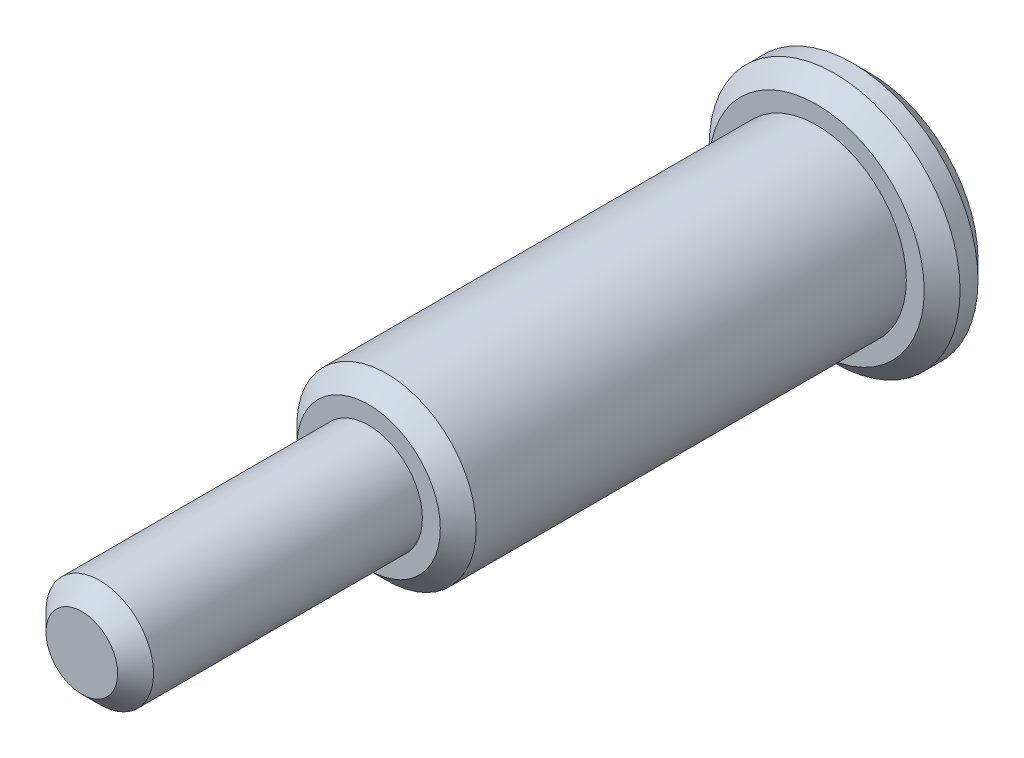
ISO-10303-21;
HEADER;
FILE_DESCRIPTION(('STEP AP214'),'2;1');
FILE_NAME('part.step','',(''),(''),'','','');
FILE_SCHEMA(('AUTOMOTIVE_DESIGN { 1 0 10303 214 1 1 1 1 }'));
ENDSEC;
DATA;
#1=APPLICATION_CONTEXT('core data for automotive mechanical design processes');
#2=APPLICATION_PROTOCOL_DEFINITION('international standard','automotive_design',2000,#1);
#3=PRODUCT_CONTEXT('',#1,'mechanical');
#4=PRODUCT('Part','Part','',(#3));
#5=PRODUCT_RELATED_PRODUCT_CATEGORY('part','',(#4));
#6=PRODUCT_DEFINITION_FORMATION('','',#4);
#7=PRODUCT_DEFINITION_CONTEXT('part definition',#1,'design');
#8=PRODUCT_DEFINITION('design','',#6,#7);
#9=PRODUCT_DEFINITION_SHAPE('','',#8);
#10=(LENGTH_UNIT() NAMED_UNIT(*) SI_UNIT(.MILLI.,.METRE.));
#11=(NAMED_UNIT(*) PLANE_ANGLE_UNIT() SI_UNIT($,.RADIAN.));
#12=(NAMED_UNIT(*) SI_UNIT($,.STERADIAN.) SOLID_ANGLE_UNIT());
#13=UNCERTAINTY_MEASURE_WITH_UNIT(LENGTH_MEASURE(1.E-05),#10,'distance_accuracy_value','');
#14=(GEOMETRIC_REPRESENTATION_CONTEXT(3) GLOBAL_UNCERTAINTY_ASSIGNED_CONTEXT((#13)) GLOBAL_UNIT_ASSIGNED_CONTEXT((#10,
#11,#12)) REPRESENTATION_CONTEXT('',''));
#15=CARTESIAN_POINT('',(0.,0.,0.));
#16=DIRECTION('',(0.,0.,1.));
#17=DIRECTION('',(1.,0.,0.));
#18=AXIS2_PLACEMENT_3D('',#15,#16,#17);
#19=CARTESIAN_POINT('',(0.,0.,0.));
#20=DIRECTION('',(0.,0.,-1.));
#21=DIRECTION('',(-1.,0.,0.));
#22=AXIS2_PLACEMENT_3D('',#19,#20,#21);
#23=PLANE('',#22);
#24=CARTESIAN_POINT('',(0.,0.,0.));
#25=DIRECTION('',(0.,0.,-1.));
#26=DIRECTION('',(-1.,0.,0.));
#27=AXIS2_PLACEMENT_3D('',#24,#25,#26);
#28=CIRCLE('',#27,5.99999999999999);
#29=CARTESIAN_POINT('',(-5.99999999999999,0.,0.));
#30=VERTEX_POINT('',#29);
#31=EDGE_CURVE('E37',#30,#30,#28,.T.);
#32=ORIENTED_EDGE('',*,*,#31,.T.);
#33=EDGE_LOOP('',(#32));
#34=FACE_BOUND('',#33,.T.);
#35=ADVANCED_FACE('F30',(#34),#23,.T.);
#36=CARTESIAN_POINT('',(0.,0.,44.));
#37=DIRECTION('',(0.,0.,1.));
#38=DIRECTION('',(1.,0.,0.));
#39=AXIS2_PLACEMENT_3D('',#36,#37,#38);
#40=CYLINDRICAL_SURFACE('',#39,7.);
#41=CARTESIAN_POINT('',(0.,0.,1.00000000000001));
#42=DIRECTION('',(0.,0.,-1.));
#43=DIRECTION('',(-1.,0.,0.));
#44=AXIS2_PLACEMENT_3D('',#41,#42,#43);
#45=CIRCLE('',#44,7.);
#46=CARTESIAN_POINT('',(-7.,0.,1.00000000000001));
#47=VERTEX_POINT('',#46);
#48=EDGE_CURVE('E41',#47,#47,#45,.F.);
#49=ORIENTED_EDGE('',*,*,#48,.T.);
#50=EDGE_LOOP('',(#49));
#51=FACE_BOUND('',#50,.T.);
#52=CARTESIAN_POINT('',(0.,0.,2.));
#53=DIRECTION('',(0.,0.,1.));
#54=DIRECTION('',(1.,0.,0.));
#55=AXIS2_PLACEMENT_3D('',#52,#53,#54);
#56=CIRCLE('',#55,7.);
#57=CARTESIAN_POINT('',(7.,0.,2.));
#58=VERTEX_POINT('',#57);
#59=EDGE_CURVE('E45',#58,#58,#56,.F.);
#60=ORIENTED_EDGE('',*,*,#59,.T.);
#61=EDGE_LOOP('',(#60));
#62=FACE_BOUND('',#61,.T.);
#63=ADVANCED_FACE('F87',(#51,#62),#40,.T.);
#64=CARTESIAN_POINT('',(7.,0.,3.));
#65=DIRECTION('',(0.,0.,1.));
#66=DIRECTION('',(1.,0.,0.));
#67=AXIS2_PLACEMENT_3D('',#64,#65,#66);
#68=PLANE('',#67);
#69=CARTESIAN_POINT('',(0.,0.,3.));
#70=DIRECTION('',(0.,0.,1.));
#71=DIRECTION('',(1.,0.,0.));
#72=AXIS2_PLACEMENT_3D('',#69,#70,#71);
#73=CIRCLE('',#72,6.00000000000001);
#74=CARTESIAN_POINT('',(6.00000000000001,0.,3.));
#75=VERTEX_POINT('',#74);
#76=EDGE_CURVE('E10',#75,#75,#73,.T.);
#77=ORIENTED_EDGE('',*,*,#76,.T.);
#78=EDGE_LOOP('',(#77));
#79=FACE_BOUND('',#78,.T.);
#80=CARTESIAN_POINT('',(0.,0.,3.));
#81=DIRECTION('',(0.,0.,1.));
#82=DIRECTION('',(1.,0.,0.));
#83=AXIS2_PLACEMENT_3D('',#80,#81,#82);
#84=CIRCLE('',#83,5.);
#85=CARTESIAN_POINT('',(5.,0.,3.));
#86=VERTEX_POINT('',#85);
#87=EDGE_CURVE('E62',#86,#86,#84,.T.);
#88=ORIENTED_EDGE('',*,*,#87,.F.);
#89=EDGE_LOOP('',(#88));
#90=FACE_BOUND('',#89,.T.);
#91=ADVANCED_FACE('F83',(#79,#90),#68,.T.);
#92=CARTESIAN_POINT('',(0.,0.,44.));
#93=DIRECTION('',(0.,0.,1.));
#94=DIRECTION('',(1.,0.,0.));
#95=AXIS2_PLACEMENT_3D('',#92,#93,#94);
#96=CYLINDRICAL_SURFACE('',#95,5.);
#97=CARTESIAN_POINT('',(0.,0.,27.));
#98=DIRECTION('',(0.,0.,1.));
#99=DIRECTION('',(1.,0.,0.));
#100=AXIS2_PLACEMENT_3D('',#97,#98,#99);
#101=CIRCLE('',#100,5.);
#102=CARTESIAN_POINT('',(5.,0.,27.));
#103=VERTEX_POINT('',#102);
#104=EDGE_CURVE('E50',#103,#103,#101,.F.);
#105=ORIENTED_EDGE('',*,*,#104,.T.);
#106=EDGE_LOOP('',(#105));
#107=FACE_BOUND('',#106,.T.);
#108=ORIENTED_EDGE('',*,*,#87,.T.);
#109=EDGE_LOOP('',(#108));
#110=FACE_BOUND('',#109,.T.);
#111=ADVANCED_FACE('F73',(#107,#110),#96,.T.);
#112=CARTESIAN_POINT('',(5.,0.,28.));
#113=DIRECTION('',(0.,0.,1.));
#114=DIRECTION('',(1.,0.,0.));
#115=AXIS2_PLACEMENT_3D('',#112,#113,#114);
#116=PLANE('',#115);
#117=CARTESIAN_POINT('',(0.,0.,28.));
#118=DIRECTION('',(0.,0.,1.));
#119=DIRECTION('',(1.,0.,0.));
#120=AXIS2_PLACEMENT_3D('',#117,#118,#119);
#121=CIRCLE('',#120,4.);
#122=CARTESIAN_POINT('',(4.,0.,28.));
#123=VERTEX_POINT('',#122);
#124=EDGE_CURVE('E53',#123,#123,#121,.T.);
#125=ORIENTED_EDGE('',*,*,#124,.T.);
#126=EDGE_LOOP('',(#125));
#127=FACE_BOUND('',#126,.T.);
#128=CARTESIAN_POINT('',(0.,0.,28.));
#129=DIRECTION('',(0.,0.,1.));
#130=DIRECTION('',(1.,0.,0.));
#131=AXIS2_PLACEMENT_3D('',#128,#129,#130);
#132=CIRCLE('',#131,3.);
#133=CARTESIAN_POINT('',(3.,0.,28.));
#134=VERTEX_POINT('',#133);
#135=EDGE_CURVE('E65',#134,#134,#132,.T.);
#136=ORIENTED_EDGE('',*,*,#135,.F.);
#137=EDGE_LOOP('',(#136));
#138=FACE_BOUND('',#137,.T.);
#139=ADVANCED_FACE('F71',(#127,#138),#116,.T.);
#140=CARTESIAN_POINT('',(0.,0.,44.));
#141=DIRECTION('',(0.,0.,1.));
#142=DIRECTION('',(1.,0.,0.));
#143=AXIS2_PLACEMENT_3D('',#140,#141,#142);
#144=CYLINDRICAL_SURFACE('',#143,3.);
#145=CARTESIAN_POINT('',(0.,0.,43.));
#146=DIRECTION('',(0.,0.,1.));
#147=DIRECTION('',(1.,0.,0.));
#148=AXIS2_PLACEMENT_3D('',#145,#146,#147);
#149=CIRCLE('',#148,3.);
#150=CARTESIAN_POINT('',(3.,0.,43.));
#151=VERTEX_POINT('',#150);
#152=EDGE_CURVE('E56',#151,#151,#149,.F.);
#153=ORIENTED_EDGE('',*,*,#152,.T.);
#154=EDGE_LOOP('',(#153));
#155=FACE_BOUND('',#154,.T.);
#156=ORIENTED_EDGE('',*,*,#135,.T.);
#157=EDGE_LOOP('',(#156));
#158=FACE_BOUND('',#157,.T.);
#159=ADVANCED_FACE('F69',(#155,#158),#144,.T.);
#160=CARTESIAN_POINT('',(3.,0.,44.));
#161=DIRECTION('',(0.,0.,1.));
#162=DIRECTION('',(1.,0.,0.));
#163=AXIS2_PLACEMENT_3D('',#160,#161,#162);
#164=PLANE('',#163);
#165=CARTESIAN_POINT('',(0.,0.,44.));
#166=DIRECTION('',(0.,0.,1.));
#167=DIRECTION('',(1.,0.,0.));
#168=AXIS2_PLACEMENT_3D('',#165,#166,#167);
#169=CIRCLE('',#168,1.99999999999999);
#170=CARTESIAN_POINT('',(1.99999999999999,0.,44.));
#171=VERTEX_POINT('',#170);
#172=EDGE_CURVE('E59',#171,#171,#169,.T.);
#173=ORIENTED_EDGE('',*,*,#172,.T.);
#174=EDGE_LOOP('',(#173));
#175=FACE_BOUND('',#174,.T.);
#176=ADVANCED_FACE('F80',(#175),#164,.T.);
#177=CARTESIAN_POINT('',(0.,0.,44.));
#178=DIRECTION('',(0.,0.,-1.));
#179=DIRECTION('',(-1.,0.,0.));
#180=AXIS2_PLACEMENT_3D('',#177,#178,#179);
#181=CONICAL_SURFACE('',#180,1.99999999999999,0.785398163397447);
#182=ORIENTED_EDGE('',*,*,#152,.F.);
#183=EDGE_LOOP('',(#182));
#184=FACE_BOUND('',#183,.T.);
#185=ORIENTED_EDGE('',*,*,#172,.F.);
#186=EDGE_LOOP('',(#185));
#187=FACE_BOUND('',#186,.T.);
#188=ADVANCED_FACE('F96',(#184,#187),#181,.T.);
#189=CARTESIAN_POINT('',(0.,0.,28.));
#190=DIRECTION('',(0.,0.,-1.));
#191=DIRECTION('',(-1.,0.,0.));
#192=AXIS2_PLACEMENT_3D('',#189,#190,#191);
#193=CONICAL_SURFACE('',#192,4.,0.785398163397452);
#194=ORIENTED_EDGE('',*,*,#104,.F.);
#195=EDGE_LOOP('',(#194));
#196=FACE_BOUND('',#195,.T.);
#197=ORIENTED_EDGE('',*,*,#124,.F.);
#198=EDGE_LOOP('',(#197));
#199=FACE_BOUND('',#198,.T.);
#200=ADVANCED_FACE('F99',(#196,#199),#193,.T.);
#201=CARTESIAN_POINT('',(0.,0.,1.00000000000001));
#202=DIRECTION('',(0.,0.,1.));
#203=DIRECTION('',(1.,0.,0.));
#204=AXIS2_PLACEMENT_3D('',#201,#202,#203);
#205=CONICAL_SURFACE('',#204,7.,0.785398163397448);
#206=ORIENTED_EDGE('',*,*,#31,.F.);
#207=EDGE_LOOP('',(#206));
#208=FACE_BOUND('',#207,.T.);
#209=ORIENTED_EDGE('',*,*,#48,.F.);
#210=EDGE_LOOP('',(#209));
#211=FACE_BOUND('',#210,.T.);
#212=ADVANCED_FACE('F102',(#208,#211),#205,.T.);
#213=CARTESIAN_POINT('',(0.,0.,3.));
#214=DIRECTION('',(0.,0.,-1.));
#215=DIRECTION('',(-1.,0.,0.));
#216=AXIS2_PLACEMENT_3D('',#213,#214,#215);
#217=CONICAL_SURFACE('',#216,6.00000000000001,0.785398163397445);
#218=ORIENTED_EDGE('',*,*,#59,.F.);
#219=EDGE_LOOP('',(#218));
#220=FACE_BOUND('',#219,.T.);
#221=ORIENTED_EDGE('',*,*,#76,.F.);
#222=EDGE_LOOP('',(#221));
#223=FACE_BOUND('',#222,.T.);
#224=ADVANCED_FACE('F32',(#220,#223),#217,.T.);
#225=CLOSED_SHELL('',(#35,#63,#91,#111,#139,#159,#176,#188,#200,#212,#224));
#226=MANIFOLD_SOLID_BREP('B2',#225);
#227=ADVANCED_BREP_SHAPE_REPRESENTATION('',(#18,#226),#14);
#228=SHAPE_DEFINITION_REPRESENTATION(#9,#227);
ENDSEC;
END-ISO-10303-21;
